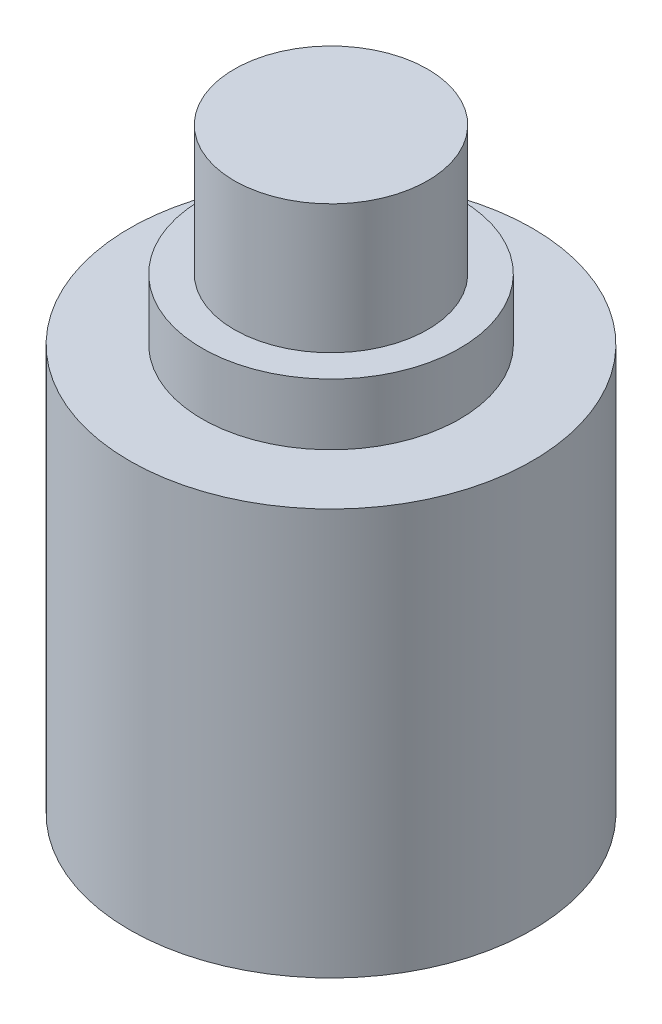
ISO-10303-21;
HEADER;
FILE_DESCRIPTION(('STEP AP214'),'2;1');
FILE_NAME('part.step','',(''),(''),'','','');
FILE_SCHEMA(('AUTOMOTIVE_DESIGN { 1 0 10303 214 1 1 1 1 }'));
ENDSEC;
DATA;
#1=APPLICATION_CONTEXT('core data for automotive mechanical design processes');
#2=APPLICATION_PROTOCOL_DEFINITION('international standard','automotive_design',2000,#1);
#3=PRODUCT_CONTEXT('',#1,'mechanical');
#4=PRODUCT('Part','Part','',(#3));
#5=PRODUCT_RELATED_PRODUCT_CATEGORY('part','',(#4));
#6=PRODUCT_DEFINITION_FORMATION('','',#4);
#7=PRODUCT_DEFINITION_CONTEXT('part definition',#1,'design');
#8=PRODUCT_DEFINITION('design','',#6,#7);
#9=PRODUCT_DEFINITION_SHAPE('','',#8);
#10=(LENGTH_UNIT() NAMED_UNIT(*) SI_UNIT(.MILLI.,.METRE.));
#11=(NAMED_UNIT(*) PLANE_ANGLE_UNIT() SI_UNIT($,.RADIAN.));
#12=(NAMED_UNIT(*) SI_UNIT($,.STERADIAN.) SOLID_ANGLE_UNIT());
#13=UNCERTAINTY_MEASURE_WITH_UNIT(LENGTH_MEASURE(1.E-05),#10,'distance_accuracy_value','');
#14=(GEOMETRIC_REPRESENTATION_CONTEXT(3) GLOBAL_UNCERTAINTY_ASSIGNED_CONTEXT((#13)) GLOBAL_UNIT_ASSIGNED_CONTEXT((#10,
#11,#12)) REPRESENTATION_CONTEXT('',''));
#15=CARTESIAN_POINT('',(0.,0.,0.));
#16=DIRECTION('',(0.,0.,1.));
#17=DIRECTION('',(1.,0.,0.));
#18=AXIS2_PLACEMENT_3D('',#15,#16,#17);
#19=CARTESIAN_POINT('',(0.,25.2,0.));
#20=DIRECTION('',(0.,-1.,0.));
#21=DIRECTION('',(0.,0.,-1.));
#22=AXIS2_PLACEMENT_3D('',#19,#20,#21);
#23=CYLINDRICAL_SURFACE('',#22,12.5);
#24=CARTESIAN_POINT('',(0.,25.2,0.));
#25=DIRECTION('',(0.,1.,0.));
#26=DIRECTION('',(0.,0.,1.));
#27=AXIS2_PLACEMENT_3D('',#24,#25,#26);
#28=CIRCLE('',#27,12.5);
#29=CARTESIAN_POINT('',(0.,25.2,12.5));
#30=VERTEX_POINT('',#29);
#31=EDGE_CURVE('E45',#30,#30,#28,.T.);
#32=ORIENTED_EDGE('',*,*,#31,.F.);
#33=EDGE_LOOP('',(#32));
#34=FACE_BOUND('',#33,.T.);
#35=CARTESIAN_POINT('',(0.,0.,0.));
#36=DIRECTION('',(0.,1.,0.));
#37=DIRECTION('',(0.,0.,1.));
#38=AXIS2_PLACEMENT_3D('',#35,#36,#37);
#39=CIRCLE('',#38,12.5);
#40=CARTESIAN_POINT('',(0.,0.,12.5));
#41=VERTEX_POINT('',#40);
#42=EDGE_CURVE('E36',#41,#41,#39,.T.);
#43=ORIENTED_EDGE('',*,*,#42,.T.);
#44=EDGE_LOOP('',(#43));
#45=FACE_BOUND('',#44,.T.);
#46=ADVANCED_FACE('F33',(#34,#45),#23,.T.);
#47=CARTESIAN_POINT('',(0.,25.2,0.));
#48=DIRECTION('',(0.,1.,0.));
#49=DIRECTION('',(0.,0.,1.));
#50=AXIS2_PLACEMENT_3D('',#47,#48,#49);
#51=PLANE('',#50);
#52=CARTESIAN_POINT('',(0.,25.2,0.));
#53=DIRECTION('',(0.,1.,0.));
#54=DIRECTION('',(0.,0.,1.));
#55=AXIS2_PLACEMENT_3D('',#52,#53,#54);
#56=CIRCLE('',#55,8.);
#57=CARTESIAN_POINT('',(0.,25.2,-8.));
#58=VERTEX_POINT('',#57);
#59=EDGE_CURVE('E40',#58,#58,#56,.T.);
#60=ORIENTED_EDGE('',*,*,#59,.F.);
#61=EDGE_LOOP('',(#60));
#62=FACE_BOUND('',#61,.T.);
#63=ORIENTED_EDGE('',*,*,#31,.T.);
#64=EDGE_LOOP('',(#63));
#65=FACE_BOUND('',#64,.T.);
#66=ADVANCED_FACE('F62',(#62,#65),#51,.T.);
#67=CARTESIAN_POINT('',(0.,0.,0.));
#68=DIRECTION('',(0.,1.,0.));
#69=DIRECTION('',(0.,0.,1.));
#70=AXIS2_PLACEMENT_3D('',#67,#68,#69);
#71=PLANE('',#70);
#72=ORIENTED_EDGE('',*,*,#42,.F.);
#73=EDGE_LOOP('',(#72));
#74=FACE_BOUND('',#73,.T.);
#75=ADVANCED_FACE('F59',(#74),#71,.F.);
#76=CARTESIAN_POINT('',(0.,29.,0.));
#77=DIRECTION('',(0.,-1.,0.));
#78=DIRECTION('',(0.,0.,-1.));
#79=AXIS2_PLACEMENT_3D('',#76,#77,#78);
#80=CYLINDRICAL_SURFACE('',#79,8.);
#81=CARTESIAN_POINT('',(0.,29.,0.));
#82=DIRECTION('',(0.,1.,0.));
#83=DIRECTION('',(0.,0.,1.));
#84=AXIS2_PLACEMENT_3D('',#81,#82,#83);
#85=CIRCLE('',#84,8.);
#86=CARTESIAN_POINT('',(0.,29.,-8.));
#87=VERTEX_POINT('',#86);
#88=EDGE_CURVE('E50',#87,#87,#85,.T.);
#89=CARTESIAN_POINT('',(0.,29.,-8.));
#90=CARTESIAN_POINT('',(0.,28.9604166666667,-8.));
#91=CARTESIAN_POINT('',(0.,28.9208333333333,-8.));
#92=CARTESIAN_POINT('',(0.,28.8416666666667,-8.));
#93=CARTESIAN_POINT('',(0.,28.8020833333333,-8.));
#94=CARTESIAN_POINT('',(0.,28.7229166666667,-8.));
#95=CARTESIAN_POINT('',(0.,28.6833333333333,-8.));
#96=CARTESIAN_POINT('',(0.,28.6041666666667,-8.));
#97=CARTESIAN_POINT('',(0.,28.5645833333333,-8.));
#98=CARTESIAN_POINT('',(0.,28.4854166666667,-8.));
#99=CARTESIAN_POINT('',(0.,28.4458333333333,-8.));
#100=CARTESIAN_POINT('',(0.,28.3666666666667,-8.));
#101=CARTESIAN_POINT('',(0.,28.3270833333333,-8.));
#102=CARTESIAN_POINT('',(0.,28.2479166666667,-8.));
#103=CARTESIAN_POINT('',(0.,28.2083333333333,-8.));
#104=CARTESIAN_POINT('',(0.,28.1291666666667,-8.));
#105=CARTESIAN_POINT('',(0.,28.0895833333333,-8.));
#106=CARTESIAN_POINT('',(0.,28.0104166666667,-8.));
#107=CARTESIAN_POINT('',(0.,27.9708333333333,-8.));
#108=CARTESIAN_POINT('',(0.,27.8916666666667,-8.));
#109=CARTESIAN_POINT('',(0.,27.8520833333333,-8.));
#110=CARTESIAN_POINT('',(0.,27.7729166666667,-8.));
#111=CARTESIAN_POINT('',(0.,27.7333333333333,-8.));
#112=CARTESIAN_POINT('',(0.,27.6541666666667,-8.));
#113=CARTESIAN_POINT('',(0.,27.6145833333333,-8.));
#114=CARTESIAN_POINT('',(0.,27.5354166666667,-8.));
#115=CARTESIAN_POINT('',(0.,27.4958333333333,-8.));
#116=CARTESIAN_POINT('',(0.,27.4166666666667,-8.));
#117=CARTESIAN_POINT('',(0.,27.3770833333333,-8.));
#118=CARTESIAN_POINT('',(0.,27.2979166666667,-8.));
#119=CARTESIAN_POINT('',(0.,27.2583333333333,-8.));
#120=CARTESIAN_POINT('',(0.,27.1791666666667,-8.));
#121=CARTESIAN_POINT('',(0.,27.1395833333333,-8.));
#122=CARTESIAN_POINT('',(0.,27.0604166666667,-8.));
#123=CARTESIAN_POINT('',(0.,27.0208333333333,-8.));
#124=CARTESIAN_POINT('',(0.,26.9416666666667,-8.));
#125=CARTESIAN_POINT('',(0.,26.9020833333333,-8.));
#126=CARTESIAN_POINT('',(0.,26.8229166666667,-8.));
#127=CARTESIAN_POINT('',(0.,26.7833333333333,-8.));
#128=CARTESIAN_POINT('',(0.,26.7041666666667,-8.));
#129=CARTESIAN_POINT('',(0.,26.6645833333333,-8.));
#130=CARTESIAN_POINT('',(0.,26.5854166666667,-8.));
#131=CARTESIAN_POINT('',(0.,26.5458333333333,-8.));
#132=CARTESIAN_POINT('',(0.,26.4666666666667,-8.));
#133=CARTESIAN_POINT('',(0.,26.4270833333333,-8.));
#134=CARTESIAN_POINT('',(0.,26.3479166666667,-8.));
#135=CARTESIAN_POINT('',(0.,26.3083333333333,-8.));
#136=CARTESIAN_POINT('',(0.,26.2291666666667,-8.));
#137=CARTESIAN_POINT('',(0.,26.1895833333333,-8.));
#138=CARTESIAN_POINT('',(0.,26.1104166666667,-8.));
#139=CARTESIAN_POINT('',(0.,26.0708333333333,-8.));
#140=CARTESIAN_POINT('',(0.,25.9916666666667,-8.));
#141=CARTESIAN_POINT('',(0.,25.9520833333333,-8.));
#142=CARTESIAN_POINT('',(0.,25.8729166666667,-8.));
#143=CARTESIAN_POINT('',(0.,25.8333333333333,-8.));
#144=CARTESIAN_POINT('',(0.,25.7541666666667,-8.));
#145=CARTESIAN_POINT('',(0.,25.7145833333333,-8.));
#146=CARTESIAN_POINT('',(0.,25.6354166666667,-8.));
#147=CARTESIAN_POINT('',(0.,25.5958333333333,-8.));
#148=CARTESIAN_POINT('',(0.,25.5166666666667,-8.));
#149=CARTESIAN_POINT('',(0.,25.4770833333333,-8.));
#150=CARTESIAN_POINT('',(0.,25.3979166666667,-8.));
#151=CARTESIAN_POINT('',(0.,25.3583333333333,-8.));
#152=CARTESIAN_POINT('',(0.,25.2791666666667,-8.));
#153=CARTESIAN_POINT('',(0.,25.2395833333333,-8.));
#154=CARTESIAN_POINT('',(0.,25.2,-8.));
#155=B_SPLINE_CURVE_WITH_KNOTS('',3,(#89,#90,#91,#92,#93,#94,#95,#96,#97,#98,#99,#100,#101,#102,
#103,#104,#105,#106,#107,#108,#109,#110,#111,#112,#113,#114,#115,#116,#117,#118,#119,#120,#121,
#122,#123,#124,#125,#126,#127,#128,#129,#130,#131,#132,#133,#134,#135,#136,#137,#138,#139,#140,
#141,#142,#143,#144,#145,#146,#147,#148,#149,#150,#151,#152,#153,#154),.UNSPECIFIED.,.F.,.F.,(4,
2,2,2,2,2,2,2,2,2,2,2,2,2,2,2,2,2,2,2,2,2,2,2,2,2,2,2,2,2,2,2,4),(0.,0.118750000000001,
0.237500000000002,0.356250000000002,0.475000000000003,0.593750000000001,0.712500000000001,
0.831250000000002,0.950000000000003,1.06875,1.1875,1.30625,1.425,1.54375,1.6625,1.78125,1.9,
2.01875,2.1375,2.25625,2.375,2.49375,2.6125,2.73125,2.85,2.96875,3.0875,3.20625,
3.32500000000001,3.44375,3.5625,3.68125,3.8),.UNSPECIFIED.);
#156=EDGE_CURVE('BSEAM61',#87,#58,#155,.T.);
#157=ORIENTED_EDGE('',*,*,#88,.F.);
#158=ORIENTED_EDGE('',*,*,#59,.T.);
#159=ORIENTED_EDGE('',*,*,#156,.T.);
#160=ORIENTED_EDGE('',*,*,#156,.F.);
#161=EDGE_LOOP('',(#157,#159,#158,#160));
#162=FACE_BOUND('',#161,.T.);
#163=ADVANCED_FACE('F61',(#162),#80,.T.);
#164=CARTESIAN_POINT('',(0.,29.,0.));
#165=DIRECTION('',(0.,1.,0.));
#166=DIRECTION('',(0.,0.,1.));
#167=AXIS2_PLACEMENT_3D('',#164,#165,#166);
#168=PLANE('',#167);
#169=CARTESIAN_POINT('',(0.,29.,0.));
#170=DIRECTION('',(0.,1.,0.));
#171=DIRECTION('',(0.,0.,1.));
#172=AXIS2_PLACEMENT_3D('',#169,#170,#171);
#173=CIRCLE('',#172,6.);
#174=CARTESIAN_POINT('',(0.,29.,6.));
#175=VERTEX_POINT('',#174);
#176=EDGE_CURVE('E10',#175,#175,#173,.T.);
#177=ORIENTED_EDGE('',*,*,#176,.F.);
#178=EDGE_LOOP('',(#177));
#179=FACE_BOUND('',#178,.T.);
#180=ORIENTED_EDGE('',*,*,#88,.T.);
#181=EDGE_LOOP('',(#180));
#182=FACE_BOUND('',#181,.T.);
#183=ADVANCED_FACE('F67',(#179,#182),#168,.T.);
#184=CARTESIAN_POINT('',(0.,37.,0.));
#185=DIRECTION('',(0.,-1.,0.));
#186=DIRECTION('',(0.,0.,-1.));
#187=AXIS2_PLACEMENT_3D('',#184,#185,#186);
#188=CYLINDRICAL_SURFACE('',#187,6.);
#189=CARTESIAN_POINT('',(0.,37.,0.));
#190=DIRECTION('',(0.,1.,0.));
#191=DIRECTION('',(0.,0.,1.));
#192=AXIS2_PLACEMENT_3D('',#189,#190,#191);
#193=CIRCLE('',#192,6.);
#194=CARTESIAN_POINT('',(0.,37.,6.));
#195=VERTEX_POINT('',#194);
#196=EDGE_CURVE('E49',#195,#195,#193,.T.);
#197=ORIENTED_EDGE('',*,*,#196,.F.);
#198=EDGE_LOOP('',(#197));
#199=FACE_BOUND('',#198,.T.);
#200=ORIENTED_EDGE('',*,*,#176,.T.);
#201=EDGE_LOOP('',(#200));
#202=FACE_BOUND('',#201,.T.);
#203=ADVANCED_FACE('F97',(#199,#202),#188,.T.);
#204=CARTESIAN_POINT('',(0.,37.,0.));
#205=DIRECTION('',(0.,1.,0.));
#206=DIRECTION('',(0.,0.,1.));
#207=AXIS2_PLACEMENT_3D('',#204,#205,#206);
#208=PLANE('',#207);
#209=ORIENTED_EDGE('',*,*,#196,.T.);
#210=EDGE_LOOP('',(#209));
#211=FACE_BOUND('',#210,.T.);
#212=ADVANCED_FACE('F107',(#211),#208,.T.);
#213=CLOSED_SHELL('',(#46,#66,#75,#163,#183,#203,#212));
#214=MANIFOLD_SOLID_BREP('B2',#213);
#215=ADVANCED_BREP_SHAPE_REPRESENTATION('',(#18,#214),#14);
#216=SHAPE_DEFINITION_REPRESENTATION(#9,#215);
ENDSEC;
END-ISO-10303-21;
